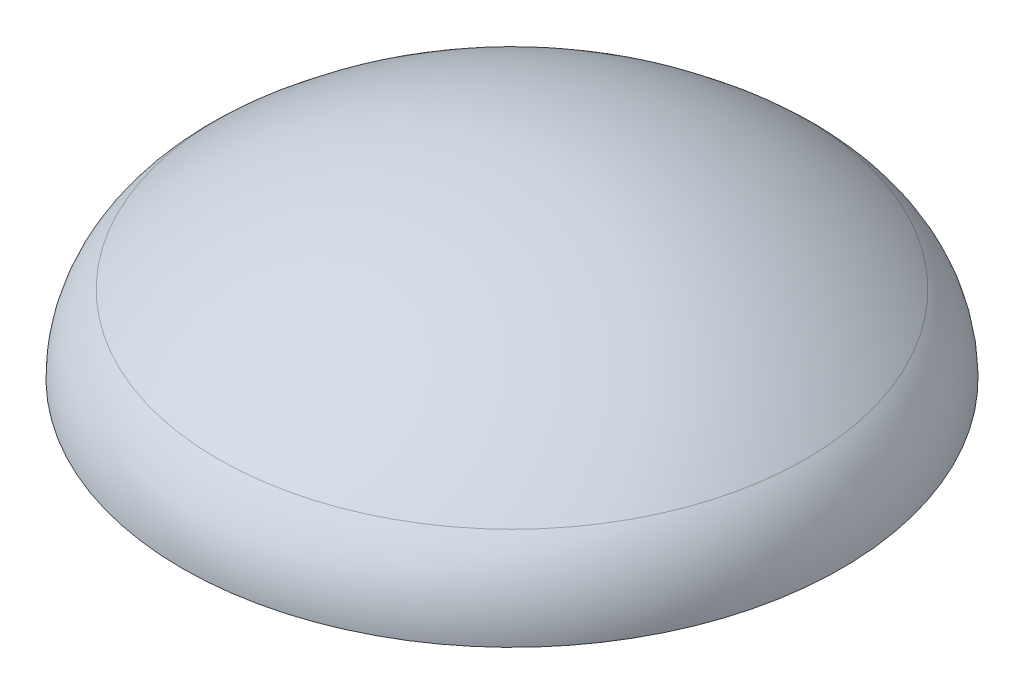
ISO-10303-21;
HEADER;
FILE_DESCRIPTION(('STEP AP214'),'2;1');
FILE_NAME('part.step','',(''),(''),'','','');
FILE_SCHEMA(('AUTOMOTIVE_DESIGN { 1 0 10303 214 1 1 1 1 }'));
ENDSEC;
DATA;
#1=APPLICATION_CONTEXT('core data for automotive mechanical design processes');
#2=APPLICATION_PROTOCOL_DEFINITION('international standard','automotive_design',2000,#1);
#3=PRODUCT_CONTEXT('',#1,'mechanical');
#4=PRODUCT('Part','Part','',(#3));
#5=PRODUCT_RELATED_PRODUCT_CATEGORY('part','',(#4));
#6=PRODUCT_DEFINITION_FORMATION('','',#4);
#7=PRODUCT_DEFINITION_CONTEXT('part definition',#1,'design');
#8=PRODUCT_DEFINITION('design','',#6,#7);
#9=PRODUCT_DEFINITION_SHAPE('','',#8);
#10=(LENGTH_UNIT() NAMED_UNIT(*) SI_UNIT(.MILLI.,.METRE.));
#11=(NAMED_UNIT(*) PLANE_ANGLE_UNIT() SI_UNIT($,.RADIAN.));
#12=(NAMED_UNIT(*) SI_UNIT($,.STERADIAN.) SOLID_ANGLE_UNIT());
#13=UNCERTAINTY_MEASURE_WITH_UNIT(LENGTH_MEASURE(1.E-05),#10,'distance_accuracy_value','');
#14=(GEOMETRIC_REPRESENTATION_CONTEXT(3) GLOBAL_UNCERTAINTY_ASSIGNED_CONTEXT((#13)) GLOBAL_UNIT_ASSIGNED_CONTEXT((#10,
#11,#12)) REPRESENTATION_CONTEXT('',''));
#15=CARTESIAN_POINT('',(0.,0.,0.));
#16=DIRECTION('',(0.,0.,1.));
#17=DIRECTION('',(1.,0.,0.));
#18=AXIS2_PLACEMENT_3D('',#15,#16,#17);
#19=CARTESIAN_POINT('',(0.,0.,0.));
#20=DIRECTION('',(0.,1.,0.));
#21=DIRECTION('',(0.,0.,1.));
#22=AXIS2_PLACEMENT_3D('',#19,#20,#21);
#23=TOROIDAL_SURFACE('',#22,48.3362,21.5138);
#24=CARTESIAN_POINT('',(0.,16.3495253668879,0.));
#25=DIRECTION('',(0.,1.,0.));
#26=DIRECTION('',(0.,0.,1.));
#27=AXIS2_PLACEMENT_3D('',#24,#25,#26);
#28=CIRCLE('',#27,62.3196405894076);
#29=CARTESIAN_POINT('',(0.,16.3495253668879,62.3196405894076));
#30=VERTEX_POINT('',#29);
#31=EDGE_CURVE('E52',#30,#30,#28,.T.);
#32=ORIENTED_EDGE('',*,*,#31,.F.);
#33=EDGE_LOOP('',(#32));
#34=FACE_BOUND('',#33,.T.);
#35=CARTESIAN_POINT('',(0.,0.,0.));
#36=DIRECTION('',(0.,1.,0.));
#37=DIRECTION('',(0.,0.,1.));
#38=AXIS2_PLACEMENT_3D('',#35,#36,#37);
#39=CIRCLE('',#38,69.85);
#40=CARTESIAN_POINT('',(0.,0.,69.85));
#41=VERTEX_POINT('',#40);
#42=EDGE_CURVE('E10',#41,#41,#39,.T.);
#43=ORIENTED_EDGE('',*,*,#42,.T.);
#44=EDGE_LOOP('',(#43));
#45=FACE_BOUND('',#44,.T.);
#46=ADVANCED_FACE('F34',(#34,#45),#23,.T.);
#47=CARTESIAN_POINT('',(66.85,0.,0.));
#48=DIRECTION('',(0.,1.,0.));
#49=DIRECTION('',(0.,0.,1.));
#50=AXIS2_PLACEMENT_3D('',#47,#48,#49);
#51=PLANE('',#50);
#52=ORIENTED_EDGE('',*,*,#42,.F.);
#53=EDGE_LOOP('',(#52));
#54=FACE_BOUND('',#53,.T.);
#55=CARTESIAN_POINT('',(0.,0.,0.));
#56=DIRECTION('',(0.,1.,0.));
#57=DIRECTION('',(0.,0.,1.));
#58=AXIS2_PLACEMENT_3D('',#55,#56,#57);
#59=CIRCLE('',#58,66.85);
#60=CARTESIAN_POINT('',(0.,0.,66.85));
#61=VERTEX_POINT('',#60);
#62=EDGE_CURVE('E41',#61,#61,#59,.T.);
#63=ORIENTED_EDGE('',*,*,#62,.T.);
#64=EDGE_LOOP('',(#63));
#65=FACE_BOUND('',#64,.T.);
#66=ADVANCED_FACE('F61',(#54,#65),#51,.F.);
#67=CARTESIAN_POINT('',(0.,0.,0.));
#68=DIRECTION('',(0.,1.,0.));
#69=DIRECTION('',(0.,0.,1.));
#70=AXIS2_PLACEMENT_3D('',#67,#68,#69);
#71=TOROIDAL_SURFACE('',#70,48.3362,18.5138);
#72=ORIENTED_EDGE('',*,*,#62,.F.);
#73=EDGE_LOOP('',(#72));
#74=FACE_BOUND('',#73,.T.);
#75=CARTESIAN_POINT('',(0.,14.0696596016272,0.));
#76=DIRECTION('',(0.,1.,0.));
#77=DIRECTION('',(0.,0.,1.));
#78=AXIS2_PLACEMENT_3D('',#75,#76,#77);
#79=CIRCLE('',#78,60.3697144132684);
#80=CARTESIAN_POINT('',(0.,14.0696596016272,60.3697144132684));
#81=VERTEX_POINT('',#80);
#82=EDGE_CURVE('E48',#81,#81,#79,.T.);
#83=ORIENTED_EDGE('',*,*,#82,.T.);
#84=EDGE_LOOP('',(#83));
#85=FACE_BOUND('',#84,.T.);
#86=ADVANCED_FACE('F65',(#74,#85),#71,.F.);
#87=CARTESIAN_POINT('',(0.,-56.514984490841,0.));
#88=DIRECTION('',(0.,1.,0.));
#89=DIRECTION('',(-1.,0.,0.));
#90=AXIS2_PLACEMENT_3D('',#87,#88,#89);
#91=SPHERICAL_SURFACE('',#90,92.88);
#92=ORIENTED_EDGE('',*,*,#82,.F.);
#93=EDGE_LOOP('',(#92));
#94=FACE_BOUND('',#93,.T.);
#95=ADVANCED_FACE('F70',(#94),#91,.F.);
#96=CARTESIAN_POINT('',(0.,-56.514984490841,0.));
#97=DIRECTION('',(0.,1.,0.));
#98=DIRECTION('',(1.,0.,0.));
#99=AXIS2_PLACEMENT_3D('',#96,#97,#98);
#100=SPHERICAL_SURFACE('',#99,95.88);
#101=ORIENTED_EDGE('',*,*,#31,.T.);
#102=EDGE_LOOP('',(#101));
#103=FACE_BOUND('',#102,.T.);
#104=ADVANCED_FACE('F58',(#103),#100,.T.);
#105=CLOSED_SHELL('',(#46,#66,#86,#95,#104));
#106=MANIFOLD_SOLID_BREP('B2',#105);
#107=ADVANCED_BREP_SHAPE_REPRESENTATION('',(#18,#106),#14);
#108=SHAPE_DEFINITION_REPRESENTATION(#9,#107);
ENDSEC;
END-ISO-10303-21;
